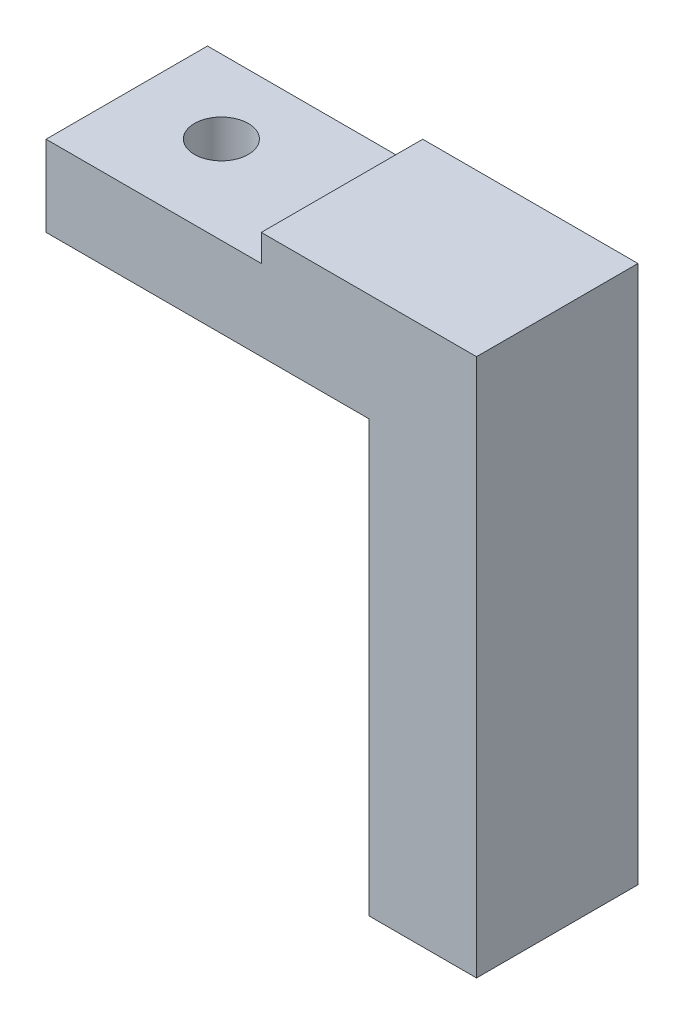
ISO-10303-21;
HEADER;
FILE_DESCRIPTION(('STEP AP214'),'2;1');
FILE_NAME('part.step','',(''),(''),'','','');
FILE_SCHEMA(('AUTOMOTIVE_DESIGN { 1 0 10303 214 1 1 1 1 }'));
ENDSEC;
DATA;
#1=APPLICATION_CONTEXT('core data for automotive mechanical design processes');
#2=APPLICATION_PROTOCOL_DEFINITION('international standard','automotive_design',2000,#1);
#3=PRODUCT_CONTEXT('',#1,'mechanical');
#4=PRODUCT('Part','Part','',(#3));
#5=PRODUCT_RELATED_PRODUCT_CATEGORY('part','',(#4));
#6=PRODUCT_DEFINITION_FORMATION('','',#4);
#7=PRODUCT_DEFINITION_CONTEXT('part definition',#1,'design');
#8=PRODUCT_DEFINITION('design','',#6,#7);
#9=PRODUCT_DEFINITION_SHAPE('','',#8);
#10=(LENGTH_UNIT() NAMED_UNIT(*) SI_UNIT(.MILLI.,.METRE.));
#11=(NAMED_UNIT(*) PLANE_ANGLE_UNIT() SI_UNIT($,.RADIAN.));
#12=(NAMED_UNIT(*) SI_UNIT($,.STERADIAN.) SOLID_ANGLE_UNIT());
#13=UNCERTAINTY_MEASURE_WITH_UNIT(LENGTH_MEASURE(1.E-05),#10,'distance_accuracy_value','');
#14=(GEOMETRIC_REPRESENTATION_CONTEXT(3) GLOBAL_UNCERTAINTY_ASSIGNED_CONTEXT((#13)) GLOBAL_UNIT_ASSIGNED_CONTEXT((#10,
#11,#12)) REPRESENTATION_CONTEXT('',''));
#15=CARTESIAN_POINT('',(0.,0.,0.));
#16=DIRECTION('',(0.,0.,1.));
#17=DIRECTION('',(1.,0.,0.));
#18=AXIS2_PLACEMENT_3D('',#15,#16,#17);
#19=CARTESIAN_POINT('',(0.,0.,0.));
#20=DIRECTION('',(0.,1.,0.));
#21=DIRECTION('',(0.,0.,1.));
#22=AXIS2_PLACEMENT_3D('',#19,#20,#21);
#23=PLANE('',#22);
#24=CARTESIAN_POINT('',(3.25,0.,2.73316016426861));
#25=DIRECTION('',(0.,1.,0.));
#26=DIRECTION('',(0.,0.,1.));
#27=AXIS2_PLACEMENT_3D('',#24,#25,#26);
#28=CIRCLE('',#27,1.);
#29=CARTESIAN_POINT('',(3.25,0.,3.73316016426861));
#30=VERTEX_POINT('',#29);
#31=EDGE_CURVE('E175',#30,#30,#28,.F.);
#32=ORIENTED_EDGE('',*,*,#31,.F.);
#33=EDGE_LOOP('',(#32));
#34=FACE_BOUND('',#33,.T.);
#35=DIRECTION('',(0.,0.,-1.));
#36=VECTOR('',#35,1.);
#37=CARTESIAN_POINT('',(12.,0.,6.));
#38=LINE('',#37,#36);
#39=CARTESIAN_POINT('',(12.,0.,6.));
#40=VERTEX_POINT('',#39);
#41=CARTESIAN_POINT('',(12.,0.,0.));
#42=VERTEX_POINT('',#41);
#43=EDGE_CURVE('E57',#40,#42,#38,.T.);
#44=ORIENTED_EDGE('',*,*,#43,.F.);
#45=DIRECTION('',(1.,0.,0.));
#46=VECTOR('',#45,1.);
#47=CARTESIAN_POINT('',(0.,0.,6.));
#48=LINE('',#47,#46);
#49=CARTESIAN_POINT('',(0.,0.,6.));
#50=VERTEX_POINT('',#49);
#51=EDGE_CURVE('E155',#50,#40,#48,.T.);
#52=ORIENTED_EDGE('',*,*,#51,.F.);
#53=DIRECTION('',(0.,0.,1.));
#54=VECTOR('',#53,1.);
#55=CARTESIAN_POINT('',(0.,0.,0.));
#56=LINE('',#55,#54);
#57=CARTESIAN_POINT('',(0.,0.,0.));
#58=VERTEX_POINT('',#57);
#59=EDGE_CURVE('E173',#58,#50,#56,.T.);
#60=ORIENTED_EDGE('',*,*,#59,.F.);
#61=DIRECTION('',(-1.,0.,0.));
#62=VECTOR('',#61,1.);
#63=CARTESIAN_POINT('',(0.,0.,0.));
#64=LINE('',#63,#62);
#65=EDGE_CURVE('E180',#42,#58,#64,.T.);
#66=ORIENTED_EDGE('',*,*,#65,.F.);
#67=EDGE_LOOP('',(#44,#52,#60,#66));
#68=FACE_BOUND('',#67,.T.);
#69=ADVANCED_FACE('F32',(#34,#68),#23,.F.);
#70=CARTESIAN_POINT('',(0.,3.,0.));
#71=DIRECTION('',(1.,0.,0.));
#72=DIRECTION('',(0.,0.,-1.));
#73=AXIS2_PLACEMENT_3D('',#70,#71,#72);
#74=PLANE('',#73);
#75=ORIENTED_EDGE('',*,*,#59,.T.);
#76=DIRECTION('',(0.,-1.,0.));
#77=VECTOR('',#76,1.);
#78=CARTESIAN_POINT('',(0.,3.,6.));
#79=LINE('',#78,#77);
#80=CARTESIAN_POINT('',(0.,3.,6.));
#81=VERTEX_POINT('',#80);
#82=EDGE_CURVE('E11',#81,#50,#79,.T.);
#83=ORIENTED_EDGE('',*,*,#82,.F.);
#84=DIRECTION('',(0.,0.,1.));
#85=VECTOR('',#84,1.);
#86=CARTESIAN_POINT('',(0.,3.,0.));
#87=LINE('',#86,#85);
#88=CARTESIAN_POINT('',(0.,3.,0.));
#89=VERTEX_POINT('',#88);
#90=EDGE_CURVE('E168',#89,#81,#87,.T.);
#91=ORIENTED_EDGE('',*,*,#90,.F.);
#92=DIRECTION('',(0.,-1.,0.));
#93=VECTOR('',#92,1.);
#94=CARTESIAN_POINT('',(0.,3.,0.));
#95=LINE('',#94,#93);
#96=EDGE_CURVE('E41',#89,#58,#95,.T.);
#97=ORIENTED_EDGE('',*,*,#96,.T.);
#98=EDGE_LOOP('',(#75,#83,#91,#97));
#99=FACE_BOUND('',#98,.T.);
#100=ADVANCED_FACE('F34',(#99),#74,.F.);
#101=CARTESIAN_POINT('',(0.,3.,6.));
#102=DIRECTION('',(0.,0.,-1.));
#103=DIRECTION('',(-1.,0.,0.));
#104=AXIS2_PLACEMENT_3D('',#101,#102,#103);
#105=PLANE('',#104);
#106=ORIENTED_EDGE('',*,*,#51,.T.);
#107=DIRECTION('',(0.,1.,0.));
#108=VECTOR('',#107,1.);
#109=CARTESIAN_POINT('',(12.,-16.,6.));
#110=LINE('',#109,#108);
#111=CARTESIAN_POINT('',(12.,-16.,6.));
#112=VERTEX_POINT('',#111);
#113=EDGE_CURVE('E160',#112,#40,#110,.T.);
#114=ORIENTED_EDGE('',*,*,#113,.F.);
#115=DIRECTION('',(-1.,0.,0.));
#116=VECTOR('',#115,1.);
#117=CARTESIAN_POINT('',(15.,-16.,6.));
#118=LINE('',#117,#116);
#119=CARTESIAN_POINT('',(16.,-16.,6.));
#120=VERTEX_POINT('',#119);
#121=EDGE_CURVE('E141',#120,#112,#118,.T.);
#122=ORIENTED_EDGE('',*,*,#121,.F.);
#123=DIRECTION('',(0.,-1.,0.));
#124=VECTOR('',#123,1.);
#125=CARTESIAN_POINT('',(16.,3.,6.));
#126=LINE('',#125,#124);
#127=CARTESIAN_POINT('',(16.,4.,6.));
#128=VERTEX_POINT('',#127);
#129=EDGE_CURVE('E105',#128,#120,#126,.T.);
#130=ORIENTED_EDGE('',*,*,#129,.F.);
#131=DIRECTION('',(1.,0.,0.));
#132=VECTOR('',#131,1.);
#133=CARTESIAN_POINT('',(8.,4.,6.));
#134=LINE('',#133,#132);
#135=CARTESIAN_POINT('',(8.,4.,6.));
#136=VERTEX_POINT('',#135);
#137=EDGE_CURVE('E99',#136,#128,#134,.T.);
#138=ORIENTED_EDGE('',*,*,#137,.F.);
#139=DIRECTION('',(0.,-1.,0.));
#140=VECTOR('',#139,1.);
#141=CARTESIAN_POINT('',(8.,4.,6.));
#142=LINE('',#141,#140);
#143=CARTESIAN_POINT('',(8.,3.,6.));
#144=VERTEX_POINT('',#143);
#145=EDGE_CURVE('E103',#136,#144,#142,.T.);
#146=ORIENTED_EDGE('',*,*,#145,.T.);
#147=DIRECTION('',(1.,0.,0.));
#148=VECTOR('',#147,1.);
#149=CARTESIAN_POINT('',(0.,3.,6.));
#150=LINE('',#149,#148);
#151=EDGE_CURVE('E166',#81,#144,#150,.T.);
#152=ORIENTED_EDGE('',*,*,#151,.F.);
#153=ORIENTED_EDGE('',*,*,#82,.T.);
#154=EDGE_LOOP('',(#106,#114,#122,#130,#138,#146,#152,#153));
#155=FACE_BOUND('',#154,.T.);
#156=ADVANCED_FACE('F101',(#155),#105,.F.);
#157=CARTESIAN_POINT('',(0.,3.,0.));
#158=DIRECTION('',(0.,0.,1.));
#159=DIRECTION('',(1.,0.,0.));
#160=AXIS2_PLACEMENT_3D('',#157,#158,#159);
#161=PLANE('',#160);
#162=DIRECTION('',(-1.,0.,0.));
#163=VECTOR('',#162,1.);
#164=CARTESIAN_POINT('',(0.,3.,0.));
#165=LINE('',#164,#163);
#166=CARTESIAN_POINT('',(8.,3.,0.));
#167=VERTEX_POINT('',#166);
#168=EDGE_CURVE('E127',#167,#89,#165,.T.);
#169=ORIENTED_EDGE('',*,*,#168,.F.);
#170=DIRECTION('',(0.,-1.,0.));
#171=VECTOR('',#170,1.);
#172=CARTESIAN_POINT('',(8.,4.,0.));
#173=LINE('',#172,#171);
#174=CARTESIAN_POINT('',(8.,4.,0.));
#175=VERTEX_POINT('',#174);
#176=EDGE_CURVE('E121',#175,#167,#173,.T.);
#177=ORIENTED_EDGE('',*,*,#176,.F.);
#178=DIRECTION('',(-1.,0.,0.));
#179=VECTOR('',#178,1.);
#180=CARTESIAN_POINT('',(8.,4.,0.));
#181=LINE('',#180,#179);
#182=CARTESIAN_POINT('',(16.,4.,0.));
#183=VERTEX_POINT('',#182);
#184=EDGE_CURVE('E115',#183,#175,#181,.T.);
#185=ORIENTED_EDGE('',*,*,#184,.F.);
#186=DIRECTION('',(0.,1.,0.));
#187=VECTOR('',#186,1.);
#188=CARTESIAN_POINT('',(16.,3.,0.));
#189=LINE('',#188,#187);
#190=CARTESIAN_POINT('',(16.,-16.,0.));
#191=VERTEX_POINT('',#190);
#192=EDGE_CURVE('E139',#191,#183,#189,.T.);
#193=ORIENTED_EDGE('',*,*,#192,.F.);
#194=DIRECTION('',(1.,0.,0.));
#195=VECTOR('',#194,1.);
#196=CARTESIAN_POINT('',(15.,-16.,0.));
#197=LINE('',#196,#195);
#198=CARTESIAN_POINT('',(12.,-16.,0.));
#199=VERTEX_POINT('',#198);
#200=EDGE_CURVE('E145',#199,#191,#197,.T.);
#201=ORIENTED_EDGE('',*,*,#200,.F.);
#202=DIRECTION('',(0.,1.,0.));
#203=VECTOR('',#202,1.);
#204=CARTESIAN_POINT('',(12.,-16.,0.));
#205=LINE('',#204,#203);
#206=EDGE_CURVE('E147',#199,#42,#205,.T.);
#207=ORIENTED_EDGE('',*,*,#206,.T.);
#208=ORIENTED_EDGE('',*,*,#65,.T.);
#209=ORIENTED_EDGE('',*,*,#96,.F.);
#210=EDGE_LOOP('',(#169,#177,#185,#193,#201,#207,#208,#209));
#211=FACE_BOUND('',#210,.T.);
#212=ADVANCED_FACE('F199',(#211),#161,.F.);
#213=CARTESIAN_POINT('',(0.,3.,0.));
#214=DIRECTION('',(0.,1.,0.));
#215=DIRECTION('',(0.,0.,1.));
#216=AXIS2_PLACEMENT_3D('',#213,#214,#215);
#217=PLANE('',#216);
#218=DIRECTION('',(0.,0.,1.));
#219=VECTOR('',#218,1.);
#220=CARTESIAN_POINT('',(8.,3.,0.));
#221=LINE('',#220,#219);
#222=EDGE_CURVE('E49',#167,#144,#221,.T.);
#223=ORIENTED_EDGE('',*,*,#222,.F.);
#224=ORIENTED_EDGE('',*,*,#168,.T.);
#225=ORIENTED_EDGE('',*,*,#90,.T.);
#226=ORIENTED_EDGE('',*,*,#151,.T.);
#227=EDGE_LOOP('',(#223,#224,#225,#226));
#228=FACE_BOUND('',#227,.T.);
#229=CARTESIAN_POINT('',(3.25,3.,2.73316016426861));
#230=DIRECTION('',(0.,1.,0.));
#231=DIRECTION('',(0.,0.,1.));
#232=AXIS2_PLACEMENT_3D('',#229,#230,#231);
#233=CIRCLE('',#232,1.);
#234=CARTESIAN_POINT('',(3.25,3.,3.73316016426861));
#235=VERTEX_POINT('',#234);
#236=EDGE_CURVE('E150',#235,#235,#233,.T.);
#237=ORIENTED_EDGE('',*,*,#236,.F.);
#238=EDGE_LOOP('',(#237));
#239=FACE_BOUND('',#238,.T.);
#240=ADVANCED_FACE('F211',(#228,#239),#217,.T.);
#241=CARTESIAN_POINT('',(3.25,-0.00100000000000013,2.73316016426861));
#242=DIRECTION('',(0.,1.,0.));
#243=DIRECTION('',(0.,0.,1.));
#244=AXIS2_PLACEMENT_3D('',#241,#242,#243);
#245=CYLINDRICAL_SURFACE('',#244,1.);
#246=CARTESIAN_POINT('',(3.25,3.,3.73316016426861));
#247=CARTESIAN_POINT('',(3.25,2.96875,3.73316016426861));
#248=CARTESIAN_POINT('',(3.25,2.9375,3.73316016426861));
#249=CARTESIAN_POINT('',(3.25,2.875,3.73316016426861));
#250=CARTESIAN_POINT('',(3.25,2.84375,3.73316016426861));
#251=CARTESIAN_POINT('',(3.25,2.78125,3.73316016426861));
#252=CARTESIAN_POINT('',(3.25,2.75,3.73316016426861));
#253=CARTESIAN_POINT('',(3.25,2.6875,3.73316016426861));
#254=CARTESIAN_POINT('',(3.25,2.65625,3.73316016426861));
#255=CARTESIAN_POINT('',(3.25,2.59375,3.73316016426861));
#256=CARTESIAN_POINT('',(3.25,2.5625,3.73316016426861));
#257=CARTESIAN_POINT('',(3.25,2.5,3.73316016426861));
#258=CARTESIAN_POINT('',(3.25,2.46875,3.73316016426861));
#259=CARTESIAN_POINT('',(3.25,2.40625,3.73316016426861));
#260=CARTESIAN_POINT('',(3.25,2.375,3.73316016426861));
#261=CARTESIAN_POINT('',(3.25,2.3125,3.73316016426861));
#262=CARTESIAN_POINT('',(3.25,2.28125,3.73316016426861));
#263=CARTESIAN_POINT('',(3.25,2.21875,3.73316016426861));
#264=CARTESIAN_POINT('',(3.25,2.1875,3.73316016426861));
#265=CARTESIAN_POINT('',(3.25,2.125,3.73316016426861));
#266=CARTESIAN_POINT('',(3.25,2.09375,3.73316016426861));
#267=CARTESIAN_POINT('',(3.25,2.03125,3.73316016426861));
#268=CARTESIAN_POINT('',(3.25,2.,3.73316016426861));
#269=CARTESIAN_POINT('',(3.25,1.9375,3.73316016426861));
#270=CARTESIAN_POINT('',(3.25,1.90625,3.73316016426861));
#271=CARTESIAN_POINT('',(3.25,1.84375,3.73316016426861));
#272=CARTESIAN_POINT('',(3.25,1.8125,3.73316016426861));
#273=CARTESIAN_POINT('',(3.25,1.75,3.73316016426861));
#274=CARTESIAN_POINT('',(3.25,1.71875,3.73316016426861));
#275=CARTESIAN_POINT('',(3.25,1.65625,3.73316016426861));
#276=CARTESIAN_POINT('',(3.25,1.625,3.73316016426861));
#277=CARTESIAN_POINT('',(3.25,1.5625,3.73316016426861));
#278=CARTESIAN_POINT('',(3.25,1.53125,3.73316016426861));
#279=CARTESIAN_POINT('',(3.25,1.46875,3.73316016426861));
#280=CARTESIAN_POINT('',(3.25,1.4375,3.73316016426861));
#281=CARTESIAN_POINT('',(3.25,1.375,3.73316016426861));
#282=CARTESIAN_POINT('',(3.25,1.34375,3.73316016426861));
#283=CARTESIAN_POINT('',(3.25,1.28125,3.73316016426861));
#284=CARTESIAN_POINT('',(3.25,1.25,3.73316016426861));
#285=CARTESIAN_POINT('',(3.25,1.1875,3.73316016426861));
#286=CARTESIAN_POINT('',(3.25,1.15625,3.73316016426861));
#287=CARTESIAN_POINT('',(3.25,1.09375,3.73316016426861));
#288=CARTESIAN_POINT('',(3.25,1.0625,3.73316016426861));
#289=CARTESIAN_POINT('',(3.25,1.,3.73316016426861));
#290=CARTESIAN_POINT('',(3.25,0.96875,3.73316016426861));
#291=CARTESIAN_POINT('',(3.25,0.90625,3.73316016426861));
#292=CARTESIAN_POINT('',(3.25,0.875,3.73316016426861));
#293=CARTESIAN_POINT('',(3.25,0.8125,3.73316016426861));
#294=CARTESIAN_POINT('',(3.25,0.78125,3.73316016426861));
#295=CARTESIAN_POINT('',(3.25,0.71875,3.73316016426861));
#296=CARTESIAN_POINT('',(3.25,0.6875,3.73316016426861));
#297=CARTESIAN_POINT('',(3.25,0.625,3.73316016426861));
#298=CARTESIAN_POINT('',(3.25,0.59375,3.73316016426861));
#299=CARTESIAN_POINT('',(3.25,0.53125,3.73316016426861));
#300=CARTESIAN_POINT('',(3.25,0.5,3.73316016426861));
#301=CARTESIAN_POINT('',(3.25,0.4375,3.73316016426861));
#302=CARTESIAN_POINT('',(3.25,0.40625,3.73316016426861));
#303=CARTESIAN_POINT('',(3.25,0.34375,3.73316016426861));
#304=CARTESIAN_POINT('',(3.25,0.3125,3.73316016426861));
#305=CARTESIAN_POINT('',(3.25,0.25,3.73316016426861));
#306=CARTESIAN_POINT('',(3.25,0.21875,3.73316016426861));
#307=CARTESIAN_POINT('',(3.25,0.15625,3.73316016426861));
#308=CARTESIAN_POINT('',(3.25,0.125,3.73316016426861));
#309=CARTESIAN_POINT('',(3.25,0.0625000000000001,3.73316016426861));
#310=CARTESIAN_POINT('',(3.25,0.0312500000000001,3.73316016426861));
#311=CARTESIAN_POINT('',(3.25,0.,3.73316016426861));
#312=B_SPLINE_CURVE_WITH_KNOTS('',3,(#246,#247,#248,#249,#250,#251,#252,#253,#254,#255,#256,
#257,#258,#259,#260,#261,#262,#263,#264,#265,#266,#267,#268,#269,#270,#271,#272,#273,#274,#275,
#276,#277,#278,#279,#280,#281,#282,#283,#284,#285,#286,#287,#288,#289,#290,#291,#292,#293,#294,
#295,#296,#297,#298,#299,#300,#301,#302,#303,#304,#305,#306,#307,#308,#309,#310,#311),
.UNSPECIFIED.,.F.,.F.,(4,2,2,2,2,2,2,2,2,2,2,2,2,2,2,2,2,2,2,2,2,2,2,2,2,2,2,2,2,2,2,2,4),(0.,
0.0937500000000001,0.1875,0.28125,0.375,0.46875,0.5625,0.65625,0.75,0.84375,0.9375,1.03125,
1.125,1.21875,1.3125,1.40625,1.5,1.59375,1.6875,1.78125,1.875,1.96875,2.0625,2.15625,2.25,
2.34375,2.4375,2.53125,2.625,2.71875,2.8125,2.90625,3.),.UNSPECIFIED.);
#313=EDGE_CURVE('BSEAM230',#235,#30,#312,.T.);
#314=ORIENTED_EDGE('',*,*,#236,.T.);
#315=ORIENTED_EDGE('',*,*,#31,.T.);
#316=ORIENTED_EDGE('',*,*,#313,.T.);
#317=ORIENTED_EDGE('',*,*,#313,.F.);
#318=EDGE_LOOP('',(#314,#316,#315,#317));
#319=FACE_BOUND('',#318,.T.);
#320=ADVANCED_FACE('F230',(#319),#245,.F.);
#321=CARTESIAN_POINT('',(12.,-16.,6.));
#322=DIRECTION('',(1.,0.,0.));
#323=DIRECTION('',(0.,0.,-1.));
#324=AXIS2_PLACEMENT_3D('',#321,#322,#323);
#325=PLANE('',#324);
#326=ORIENTED_EDGE('',*,*,#43,.T.);
#327=ORIENTED_EDGE('',*,*,#206,.F.);
#328=DIRECTION('',(0.,0.,-1.));
#329=VECTOR('',#328,1.);
#330=CARTESIAN_POINT('',(12.,-16.,6.));
#331=LINE('',#330,#329);
#332=EDGE_CURVE('E143',#112,#199,#331,.T.);
#333=ORIENTED_EDGE('',*,*,#332,.F.);
#334=ORIENTED_EDGE('',*,*,#113,.T.);
#335=EDGE_LOOP('',(#326,#327,#333,#334));
#336=FACE_BOUND('',#335,.T.);
#337=ADVANCED_FACE('F190',(#336),#325,.F.);
#338=CARTESIAN_POINT('',(0.,-16.,0.));
#339=DIRECTION('',(0.,1.,0.));
#340=DIRECTION('',(0.,0.,1.));
#341=AXIS2_PLACEMENT_3D('',#338,#339,#340);
#342=PLANE('',#341);
#343=ORIENTED_EDGE('',*,*,#200,.T.);
#344=DIRECTION('',(0.,0.,-1.));
#345=VECTOR('',#344,1.);
#346=CARTESIAN_POINT('',(16.,-16.,6.));
#347=LINE('',#346,#345);
#348=EDGE_CURVE('E123',#120,#191,#347,.T.);
#349=ORIENTED_EDGE('',*,*,#348,.F.);
#350=ORIENTED_EDGE('',*,*,#121,.T.);
#351=ORIENTED_EDGE('',*,*,#332,.T.);
#352=EDGE_LOOP('',(#343,#349,#350,#351));
#353=FACE_BOUND('',#352,.T.);
#354=ADVANCED_FACE('F194',(#353),#342,.F.);
#355=CARTESIAN_POINT('',(16.,0.,0.));
#356=DIRECTION('',(1.,0.,0.));
#357=DIRECTION('',(0.,0.,-1.));
#358=AXIS2_PLACEMENT_3D('',#355,#356,#357);
#359=PLANE('',#358);
#360=ORIENTED_EDGE('',*,*,#129,.T.);
#361=ORIENTED_EDGE('',*,*,#348,.T.);
#362=ORIENTED_EDGE('',*,*,#192,.T.);
#363=DIRECTION('',(0.,0.,-1.));
#364=VECTOR('',#363,1.);
#365=CARTESIAN_POINT('',(16.,4.,0.));
#366=LINE('',#365,#364);
#367=EDGE_CURVE('E109',#128,#183,#366,.T.);
#368=ORIENTED_EDGE('',*,*,#367,.F.);
#369=EDGE_LOOP('',(#360,#361,#362,#368));
#370=FACE_BOUND('',#369,.T.);
#371=ADVANCED_FACE('F198',(#370),#359,.T.);
#372=CARTESIAN_POINT('',(8.,4.,0.));
#373=DIRECTION('',(1.,0.,0.));
#374=DIRECTION('',(0.,0.,-1.));
#375=AXIS2_PLACEMENT_3D('',#372,#373,#374);
#376=PLANE('',#375);
#377=ORIENTED_EDGE('',*,*,#222,.T.);
#378=ORIENTED_EDGE('',*,*,#145,.F.);
#379=DIRECTION('',(0.,0.,1.));
#380=VECTOR('',#379,1.);
#381=CARTESIAN_POINT('',(8.,4.,0.));
#382=LINE('',#381,#380);
#383=EDGE_CURVE('E110',#175,#136,#382,.T.);
#384=ORIENTED_EDGE('',*,*,#383,.F.);
#385=ORIENTED_EDGE('',*,*,#176,.T.);
#386=EDGE_LOOP('',(#377,#378,#384,#385));
#387=FACE_BOUND('',#386,.T.);
#388=ADVANCED_FACE('F120',(#387),#376,.F.);
#389=CARTESIAN_POINT('',(0.,4.,0.));
#390=DIRECTION('',(0.,1.,0.));
#391=DIRECTION('',(0.,0.,1.));
#392=AXIS2_PLACEMENT_3D('',#389,#390,#391);
#393=PLANE('',#392);
#394=ORIENTED_EDGE('',*,*,#383,.T.);
#395=ORIENTED_EDGE('',*,*,#137,.T.);
#396=ORIENTED_EDGE('',*,*,#367,.T.);
#397=ORIENTED_EDGE('',*,*,#184,.T.);
#398=EDGE_LOOP('',(#394,#395,#396,#397));
#399=FACE_BOUND('',#398,.T.);
#400=ADVANCED_FACE('F113',(#399),#393,.T.);
#401=CLOSED_SHELL('',(#69,#100,#156,#212,#240,#320,#337,#354,#371,#388,#400));
#402=MANIFOLD_SOLID_BREP('B2',#401);
#403=ADVANCED_BREP_SHAPE_REPRESENTATION('',(#18,#402),#14);
#404=SHAPE_DEFINITION_REPRESENTATION(#9,#403);
ENDSEC;
END-ISO-10303-21;
